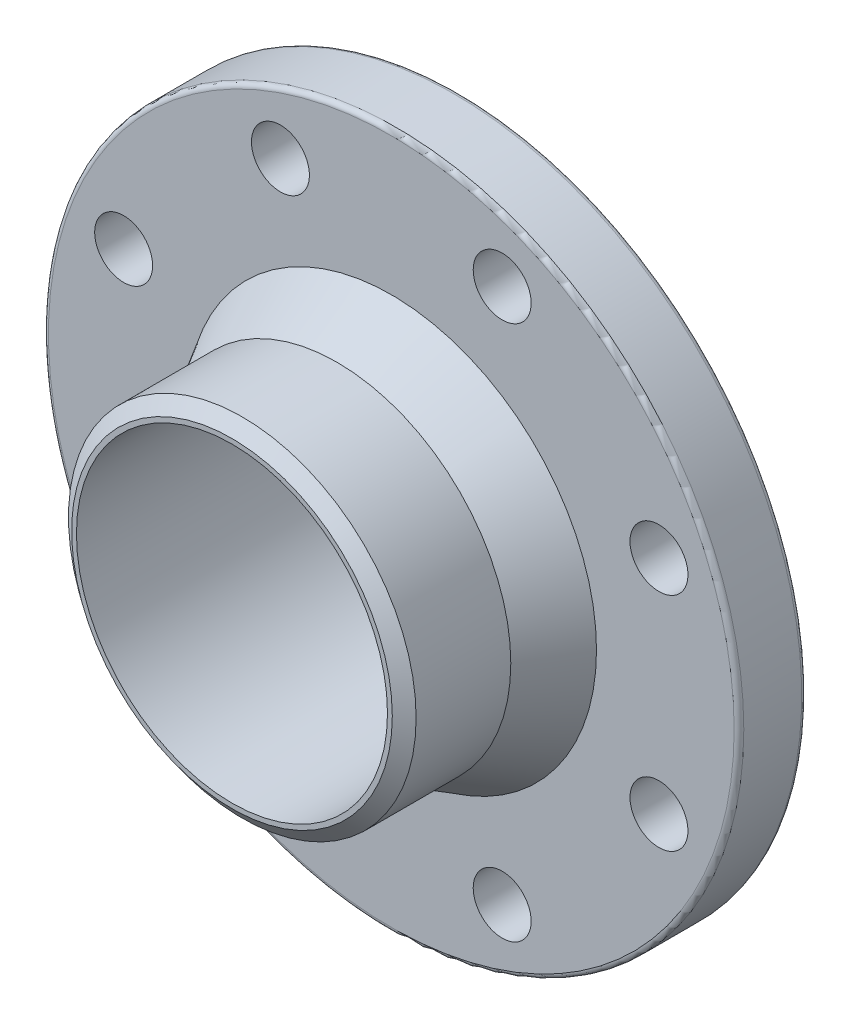
ISO-10303-21;
HEADER;
FILE_DESCRIPTION(('STEP AP214'),'2;1');
FILE_NAME('part.step','',(''),(''),'','','');
FILE_SCHEMA(('AUTOMOTIVE_DESIGN { 1 0 10303 214 1 1 1 1 }'));
ENDSEC;
DATA;
#1=APPLICATION_CONTEXT('core data for automotive mechanical design processes');
#2=APPLICATION_PROTOCOL_DEFINITION('international standard','automotive_design',2000,#1);
#3=PRODUCT_CONTEXT('',#1,'mechanical');
#4=PRODUCT('Part','Part','',(#3));
#5=PRODUCT_RELATED_PRODUCT_CATEGORY('part','',(#4));
#6=PRODUCT_DEFINITION_FORMATION('','',#4);
#7=PRODUCT_DEFINITION_CONTEXT('part definition',#1,'design');
#8=PRODUCT_DEFINITION('design','',#6,#7);
#9=PRODUCT_DEFINITION_SHAPE('','',#8);
#10=(LENGTH_UNIT() NAMED_UNIT(*) SI_UNIT(.MILLI.,.METRE.));
#11=(NAMED_UNIT(*) PLANE_ANGLE_UNIT() SI_UNIT($,.RADIAN.));
#12=(NAMED_UNIT(*) SI_UNIT($,.STERADIAN.) SOLID_ANGLE_UNIT());
#13=UNCERTAINTY_MEASURE_WITH_UNIT(LENGTH_MEASURE(1.E-05),#10,'distance_accuracy_value','');
#14=(GEOMETRIC_REPRESENTATION_CONTEXT(3) GLOBAL_UNCERTAINTY_ASSIGNED_CONTEXT((#13)) GLOBAL_UNIT_ASSIGNED_CONTEXT((#10,
#11,#12)) REPRESENTATION_CONTEXT('',''));
#15=CARTESIAN_POINT('',(0.,0.,0.));
#16=DIRECTION('',(0.,0.,1.));
#17=DIRECTION('',(1.,0.,0.));
#18=AXIS2_PLACEMENT_3D('',#15,#16,#17);
#19=CARTESIAN_POINT('',(0.,0.,0.));
#20=DIRECTION('',(0.,0.,1.));
#21=DIRECTION('',(1.,0.,0.));
#22=AXIS2_PLACEMENT_3D('',#19,#20,#21);
#23=PLANE('',#22);
#24=CARTESIAN_POINT('',(0.,0.,0.));
#25=DIRECTION('',(0.,0.,-1.));
#26=DIRECTION('',(-1.,0.,0.));
#27=AXIS2_PLACEMENT_3D('',#24,#25,#26);
#28=CIRCLE('',#27,78.58125);
#29=CARTESIAN_POINT('',(-78.58125,0.,0.));
#30=VERTEX_POINT('',#29);
#31=EDGE_CURVE('E83',#30,#30,#28,.T.);
#32=ORIENTED_EDGE('',*,*,#31,.T.);
#33=EDGE_LOOP('',(#32));
#34=FACE_BOUND('',#33,.T.);
#35=CARTESIAN_POINT('',(0.,0.,0.));
#36=DIRECTION('',(0.,0.,1.));
#37=DIRECTION('',(1.,0.,0.));
#38=AXIS2_PLACEMENT_3D('',#35,#36,#37);
#39=CIRCLE('',#38,51.1302);
#40=CARTESIAN_POINT('',(-51.1302,0.,0.));
#41=VERTEX_POINT('',#40);
#42=EDGE_CURVE('E152',#41,#41,#39,.T.);
#43=ORIENTED_EDGE('',*,*,#42,.T.);
#44=EDGE_LOOP('',(#43));
#45=FACE_BOUND('',#44,.T.);
#46=ADVANCED_FACE('F39',(#34,#45),#23,.F.);
#47=CARTESIAN_POINT('',(0.,0.,76.2));
#48=DIRECTION('',(0.,0.,1.));
#49=DIRECTION('',(1.,0.,0.));
#50=AXIS2_PLACEMENT_3D('',#47,#48,#49);
#51=PLANE('',#50);
#52=CARTESIAN_POINT('',(0.,0.,76.2));
#53=DIRECTION('',(0.,0.,1.));
#54=DIRECTION('',(1.,0.,0.));
#55=AXIS2_PLACEMENT_3D('',#52,#53,#54);
#56=CIRCLE('',#55,52.7176999999636);
#57=CARTESIAN_POINT('',(52.7176999999636,0.,76.2));
#58=VERTEX_POINT('',#57);
#59=EDGE_CURVE('E73',#58,#58,#56,.T.);
#60=ORIENTED_EDGE('',*,*,#59,.T.);
#61=EDGE_LOOP('',(#60));
#62=FACE_BOUND('',#61,.T.);
#63=CARTESIAN_POINT('',(0.,0.,76.2));
#64=DIRECTION('',(0.,0.,1.));
#65=DIRECTION('',(1.,0.,0.));
#66=AXIS2_PLACEMENT_3D('',#63,#64,#65);
#67=CIRCLE('',#66,51.1302);
#68=CARTESIAN_POINT('',(-51.1302,0.,76.2));
#69=VERTEX_POINT('',#68);
#70=EDGE_CURVE('E151',#69,#69,#67,.T.);
#71=ORIENTED_EDGE('',*,*,#70,.F.);
#72=EDGE_LOOP('',(#71));
#73=FACE_BOUND('',#72,.T.);
#74=ADVANCED_FACE('F163',(#62,#73),#51,.T.);
#75=CARTESIAN_POINT('',(0.,0.,23.8125));
#76=DIRECTION('',(0.,0.,1.));
#77=DIRECTION('',(1.,0.,0.));
#78=AXIS2_PLACEMENT_3D('',#75,#76,#77);
#79=PLANE('',#78);
#80=CARTESIAN_POINT('',(0.,0.,23.8125));
#81=DIRECTION('',(0.,0.,1.));
#82=DIRECTION('',(1.,0.,0.));
#83=AXIS2_PLACEMENT_3D('',#80,#81,#82);
#84=CIRCLE('',#83,112.7125);
#85=CARTESIAN_POINT('',(112.7125,0.,23.8125));
#86=VERTEX_POINT('',#85);
#87=EDGE_CURVE('E47',#86,#86,#84,.T.);
#88=ORIENTED_EDGE('',*,*,#87,.T.);
#89=EDGE_LOOP('',(#88));
#90=FACE_BOUND('',#89,.T.);
#91=CARTESIAN_POINT('',(87.9995254716996,36.4505969327758,23.8125));
#92=DIRECTION('',(0.,0.,1.));
#93=DIRECTION('',(0.707106781186556,-0.707106781186539,0.));
#94=AXIS2_PLACEMENT_3D('',#91,#92,#93);
#95=CIRCLE('',#94,9.52500000000001);
#96=CARTESIAN_POINT('',(94.7347175625016,29.715404841974,23.8125));
#97=VERTEX_POINT('',#96);
#98=EDGE_CURVE('E111',#97,#97,#95,.T.);
#99=ORIENTED_EDGE('',*,*,#98,.F.);
#100=EDGE_LOOP('',(#99));
#101=FACE_BOUND('',#100,.T.);
#102=CARTESIAN_POINT('',(36.4505969327755,-87.9995254716998,23.8125));
#103=DIRECTION('',(0.,0.,1.));
#104=DIRECTION('',(-0.707106781186541,-0.707106781186554,0.));
#105=AXIS2_PLACEMENT_3D('',#102,#103,#104);
#106=CIRCLE('',#105,9.52500000000001);
#107=CARTESIAN_POINT('',(29.7154048419737,-94.7347175625017,23.8125));
#108=VERTEX_POINT('',#107);
#109=EDGE_CURVE('E103',#108,#108,#106,.T.);
#110=ORIENTED_EDGE('',*,*,#109,.F.);
#111=EDGE_LOOP('',(#110));
#112=FACE_BOUND('',#111,.T.);
#113=CARTESIAN_POINT('',(-87.9995254716999,-36.4505969327752,23.8125));
#114=DIRECTION('',(0.,0.,1.));
#115=DIRECTION('',(-0.707106781186551,0.707106781186544,0.));
#116=AXIS2_PLACEMENT_3D('',#113,#114,#115);
#117=CIRCLE('',#116,9.52500000000001);
#118=CARTESIAN_POINT('',(-94.7347175625018,-29.7154048419734,23.8125));
#119=VERTEX_POINT('',#118);
#120=EDGE_CURVE('E95',#119,#119,#117,.T.);
#121=ORIENTED_EDGE('',*,*,#120,.F.);
#122=EDGE_LOOP('',(#121));
#123=FACE_BOUND('',#122,.T.);
#124=CARTESIAN_POINT('',(-36.4505969327749,87.9995254717,23.8125));
#125=DIRECTION('',(0.,0.,1.));
#126=DIRECTION('',(0.707106781186546,0.707106781186549,0.));
#127=AXIS2_PLACEMENT_3D('',#124,#125,#126);
#128=CIRCLE('',#127,9.52500000000001);
#129=CARTESIAN_POINT('',(-29.715404841973,94.7347175625019,23.8125));
#130=VERTEX_POINT('',#129);
#131=EDGE_CURVE('E87',#130,#130,#128,.T.);
#132=ORIENTED_EDGE('',*,*,#131,.F.);
#133=EDGE_LOOP('',(#132));
#134=FACE_BOUND('',#133,.T.);
#135=CARTESIAN_POINT('',(36.4505969327749,87.9995254717,23.8125));
#136=DIRECTION('',(0.,0.,1.));
#137=DIRECTION('',(1.,0.,0.));
#138=AXIS2_PLACEMENT_3D('',#135,#136,#137);
#139=CIRCLE('',#138,9.52500000000001);
#140=CARTESIAN_POINT('',(45.9755969327749,87.9995254717,23.8125));
#141=VERTEX_POINT('',#140);
#142=EDGE_CURVE('E77',#141,#141,#139,.T.);
#143=ORIENTED_EDGE('',*,*,#142,.F.);
#144=EDGE_LOOP('',(#143));
#145=FACE_BOUND('',#144,.T.);
#146=CARTESIAN_POINT('',(-87.9995254717002,36.4505969327746,23.8125));
#147=DIRECTION('',(0.,0.,1.));
#148=DIRECTION('',(0.,1.,0.));
#149=AXIS2_PLACEMENT_3D('',#146,#147,#148);
#150=CIRCLE('',#149,9.52500000000001);
#151=CARTESIAN_POINT('',(-87.9995254717002,45.9755969327746,23.8125));
#152=VERTEX_POINT('',#151);
#153=EDGE_CURVE('E91',#152,#152,#150,.T.);
#154=ORIENTED_EDGE('',*,*,#153,.F.);
#155=EDGE_LOOP('',(#154));
#156=FACE_BOUND('',#155,.T.);
#157=CARTESIAN_POINT('',(-36.4505969327749,-87.9995254717,23.8125));
#158=DIRECTION('',(0.,0.,1.));
#159=DIRECTION('',(-1.,0.,0.));
#160=AXIS2_PLACEMENT_3D('',#157,#158,#159);
#161=CIRCLE('',#160,9.52500000000001);
#162=CARTESIAN_POINT('',(-45.9755969327749,-87.9995254717,23.8125));
#163=VERTEX_POINT('',#162);
#164=EDGE_CURVE('E99',#163,#163,#161,.T.);
#165=ORIENTED_EDGE('',*,*,#164,.F.);
#166=EDGE_LOOP('',(#165));
#167=FACE_BOUND('',#166,.T.);
#168=CARTESIAN_POINT('',(87.9995254717004,-36.4505969327739,23.8125));
#169=DIRECTION('',(0.,0.,1.));
#170=DIRECTION('',(0.,-1.,0.));
#171=AXIS2_PLACEMENT_3D('',#168,#169,#170);
#172=CIRCLE('',#171,9.52500000000001);
#173=CARTESIAN_POINT('',(87.9995254717005,-45.9755969327739,23.8125));
#174=VERTEX_POINT('',#173);
#175=EDGE_CURVE('E107',#174,#174,#172,.T.);
#176=ORIENTED_EDGE('',*,*,#175,.F.);
#177=EDGE_LOOP('',(#176));
#178=FACE_BOUND('',#177,.T.);
#179=CARTESIAN_POINT('',(0.,0.,23.8125));
#180=DIRECTION('',(0.,0.,1.));
#181=DIRECTION('',(1.,0.,0.));
#182=AXIS2_PLACEMENT_3D('',#179,#180,#181);
#183=CIRCLE('',#182,67.4624);
#184=CARTESIAN_POINT('',(67.4624,0.,23.8125));
#185=VERTEX_POINT('',#184);
#186=EDGE_CURVE('E143',#185,#185,#183,.T.);
#187=ORIENTED_EDGE('',*,*,#186,.F.);
#188=EDGE_LOOP('',(#187));
#189=FACE_BOUND('',#188,.T.);
#190=ADVANCED_FACE('F165',(#90,#101,#112,#123,#134,#145,#156,#167,#178,#189),#79,.T.);
#191=CARTESIAN_POINT('',(0.,0.,23.8125));
#192=DIRECTION('',(0.,0.,-1.));
#193=DIRECTION('',(-1.,0.,0.));
#194=AXIS2_PLACEMENT_3D('',#191,#192,#193);
#195=CYLINDRICAL_SURFACE('',#194,114.3);
#196=CARTESIAN_POINT('',(0.,0.,3.175));
#197=DIRECTION('',(0.,0.,-1.));
#198=DIRECTION('',(-1.,0.,0.));
#199=AXIS2_PLACEMENT_3D('',#196,#197,#198);
#200=CIRCLE('',#199,114.3);
#201=CARTESIAN_POINT('',(-114.3,0.,3.175));
#202=VERTEX_POINT('',#201);
#203=EDGE_CURVE('E54',#202,#202,#200,.F.);
#204=ORIENTED_EDGE('',*,*,#203,.T.);
#205=EDGE_LOOP('',(#204));
#206=FACE_BOUND('',#205,.T.);
#207=CARTESIAN_POINT('',(0.,0.,22.225));
#208=DIRECTION('',(0.,0.,1.));
#209=DIRECTION('',(1.,0.,0.));
#210=AXIS2_PLACEMENT_3D('',#207,#208,#209);
#211=CIRCLE('',#210,114.3);
#212=CARTESIAN_POINT('',(114.3,0.,22.225));
#213=VERTEX_POINT('',#212);
#214=EDGE_CURVE('E60',#213,#213,#211,.F.);
#215=ORIENTED_EDGE('',*,*,#214,.T.);
#216=EDGE_LOOP('',(#215));
#217=FACE_BOUND('',#216,.T.);
#218=ADVANCED_FACE('F172',(#206,#217),#195,.T.);
#219=CARTESIAN_POINT('',(36.4505969327749,87.9995254717,23.8125));
#220=DIRECTION('',(0.,0.,-1.));
#221=DIRECTION('',(-1.,0.,0.));
#222=AXIS2_PLACEMENT_3D('',#219,#220,#221);
#223=CYLINDRICAL_SURFACE('',#222,9.52500000000001);
#224=ORIENTED_EDGE('',*,*,#142,.T.);
#225=EDGE_LOOP('',(#224));
#226=FACE_BOUND('',#225,.T.);
#227=CARTESIAN_POINT('',(36.4505969327749,87.9995254717,1.5875));
#228=DIRECTION('',(0.,0.,-1.));
#229=DIRECTION('',(-1.,0.,0.));
#230=AXIS2_PLACEMENT_3D('',#227,#228,#229);
#231=CIRCLE('',#230,9.52500000000001);
#232=CARTESIAN_POINT('',(26.9255969327749,87.9995254717,1.5875));
#233=VERTEX_POINT('',#232);
#234=EDGE_CURVE('E114',#233,#233,#231,.T.);
#235=ORIENTED_EDGE('',*,*,#234,.T.);
#236=EDGE_LOOP('',(#235));
#237=FACE_BOUND('',#236,.T.);
#238=ADVANCED_FACE('F210',(#226,#237),#223,.F.);
#239=CARTESIAN_POINT('',(-36.4505969327749,87.9995254717,23.8125));
#240=DIRECTION('',(0.,0.,-1.));
#241=DIRECTION('',(-1.,0.,0.));
#242=AXIS2_PLACEMENT_3D('',#239,#240,#241);
#243=CYLINDRICAL_SURFACE('',#242,9.52500000000001);
#244=ORIENTED_EDGE('',*,*,#131,.T.);
#245=EDGE_LOOP('',(#244));
#246=FACE_BOUND('',#245,.T.);
#247=CARTESIAN_POINT('',(-36.4505969327749,87.9995254717,1.5875));
#248=DIRECTION('',(0.,0.,-1.));
#249=DIRECTION('',(-1.,0.,0.));
#250=AXIS2_PLACEMENT_3D('',#247,#248,#249);
#251=CIRCLE('',#250,9.52500000000001);
#252=CARTESIAN_POINT('',(-45.9755969327749,87.9995254717,1.5875));
#253=VERTEX_POINT('',#252);
#254=EDGE_CURVE('E118',#253,#253,#251,.T.);
#255=ORIENTED_EDGE('',*,*,#254,.T.);
#256=EDGE_LOOP('',(#255));
#257=FACE_BOUND('',#256,.T.);
#258=ADVANCED_FACE('F206',(#246,#257),#243,.F.);
#259=CARTESIAN_POINT('',(-87.9995254717002,36.4505969327746,23.8125));
#260=DIRECTION('',(0.,0.,-1.));
#261=DIRECTION('',(-1.,0.,0.));
#262=AXIS2_PLACEMENT_3D('',#259,#260,#261);
#263=CYLINDRICAL_SURFACE('',#262,9.52500000000001);
#264=ORIENTED_EDGE('',*,*,#153,.T.);
#265=EDGE_LOOP('',(#264));
#266=FACE_BOUND('',#265,.T.);
#267=CARTESIAN_POINT('',(-87.9995254717002,36.4505969327746,1.5875));
#268=DIRECTION('',(0.,0.,-1.));
#269=DIRECTION('',(-1.,0.,0.));
#270=AXIS2_PLACEMENT_3D('',#267,#268,#269);
#271=CIRCLE('',#270,9.52500000000001);
#272=CARTESIAN_POINT('',(-97.5245254717002,36.4505969327746,1.5875));
#273=VERTEX_POINT('',#272);
#274=EDGE_CURVE('E122',#273,#273,#271,.T.);
#275=ORIENTED_EDGE('',*,*,#274,.T.);
#276=EDGE_LOOP('',(#275));
#277=FACE_BOUND('',#276,.T.);
#278=ADVANCED_FACE('F202',(#266,#277),#263,.F.);
#279=CARTESIAN_POINT('',(-87.9995254716999,-36.4505969327752,23.8125));
#280=DIRECTION('',(0.,0.,-1.));
#281=DIRECTION('',(-1.,0.,0.));
#282=AXIS2_PLACEMENT_3D('',#279,#280,#281);
#283=CYLINDRICAL_SURFACE('',#282,9.52500000000001);
#284=ORIENTED_EDGE('',*,*,#120,.T.);
#285=EDGE_LOOP('',(#284));
#286=FACE_BOUND('',#285,.T.);
#287=CARTESIAN_POINT('',(-87.9995254716999,-36.4505969327752,1.5875));
#288=DIRECTION('',(0.,0.,-1.));
#289=DIRECTION('',(-1.,0.,0.));
#290=AXIS2_PLACEMENT_3D('',#287,#288,#289);
#291=CIRCLE('',#290,9.52500000000001);
#292=CARTESIAN_POINT('',(-97.5245254716999,-36.4505969327752,1.5875));
#293=VERTEX_POINT('',#292);
#294=EDGE_CURVE('E126',#293,#293,#291,.T.);
#295=ORIENTED_EDGE('',*,*,#294,.T.);
#296=EDGE_LOOP('',(#295));
#297=FACE_BOUND('',#296,.T.);
#298=ADVANCED_FACE('F198',(#286,#297),#283,.F.);
#299=CARTESIAN_POINT('',(-36.4505969327749,-87.9995254717,23.8125));
#300=DIRECTION('',(0.,0.,-1.));
#301=DIRECTION('',(-1.,0.,0.));
#302=AXIS2_PLACEMENT_3D('',#299,#300,#301);
#303=CYLINDRICAL_SURFACE('',#302,9.52500000000001);
#304=ORIENTED_EDGE('',*,*,#164,.T.);
#305=EDGE_LOOP('',(#304));
#306=FACE_BOUND('',#305,.T.);
#307=CARTESIAN_POINT('',(-36.4505969327749,-87.9995254717,1.5875));
#308=DIRECTION('',(0.,0.,-1.));
#309=DIRECTION('',(-1.,0.,0.));
#310=AXIS2_PLACEMENT_3D('',#307,#308,#309);
#311=CIRCLE('',#310,9.52500000000001);
#312=CARTESIAN_POINT('',(-45.9755969327749,-87.9995254717,1.5875));
#313=VERTEX_POINT('',#312);
#314=EDGE_CURVE('E130',#313,#313,#311,.T.);
#315=ORIENTED_EDGE('',*,*,#314,.T.);
#316=EDGE_LOOP('',(#315));
#317=FACE_BOUND('',#316,.T.);
#318=ADVANCED_FACE('F194',(#306,#317),#303,.F.);
#319=CARTESIAN_POINT('',(36.4505969327755,-87.9995254716998,23.8125));
#320=DIRECTION('',(0.,0.,-1.));
#321=DIRECTION('',(-1.,0.,0.));
#322=AXIS2_PLACEMENT_3D('',#319,#320,#321);
#323=CYLINDRICAL_SURFACE('',#322,9.52500000000001);
#324=ORIENTED_EDGE('',*,*,#109,.T.);
#325=EDGE_LOOP('',(#324));
#326=FACE_BOUND('',#325,.T.);
#327=CARTESIAN_POINT('',(36.4505969327755,-87.9995254716998,1.5875));
#328=DIRECTION('',(0.,0.,-1.));
#329=DIRECTION('',(-1.,0.,0.));
#330=AXIS2_PLACEMENT_3D('',#327,#328,#329);
#331=CIRCLE('',#330,9.52500000000001);
#332=CARTESIAN_POINT('',(26.9255969327755,-87.9995254716998,1.5875));
#333=VERTEX_POINT('',#332);
#334=EDGE_CURVE('E134',#333,#333,#331,.T.);
#335=ORIENTED_EDGE('',*,*,#334,.T.);
#336=EDGE_LOOP('',(#335));
#337=FACE_BOUND('',#336,.T.);
#338=ADVANCED_FACE('F190',(#326,#337),#323,.F.);
#339=CARTESIAN_POINT('',(87.9995254717004,-36.4505969327739,23.8125));
#340=DIRECTION('',(0.,0.,-1.));
#341=DIRECTION('',(-1.,0.,0.));
#342=AXIS2_PLACEMENT_3D('',#339,#340,#341);
#343=CYLINDRICAL_SURFACE('',#342,9.52500000000001);
#344=ORIENTED_EDGE('',*,*,#175,.T.);
#345=EDGE_LOOP('',(#344));
#346=FACE_BOUND('',#345,.T.);
#347=CARTESIAN_POINT('',(87.9995254717004,-36.4505969327739,1.5875));
#348=DIRECTION('',(0.,0.,-1.));
#349=DIRECTION('',(-1.,0.,0.));
#350=AXIS2_PLACEMENT_3D('',#347,#348,#349);
#351=CIRCLE('',#350,9.52500000000001);
#352=CARTESIAN_POINT('',(78.4745254717004,-36.4505969327739,1.5875));
#353=VERTEX_POINT('',#352);
#354=EDGE_CURVE('E82',#353,#353,#351,.T.);
#355=ORIENTED_EDGE('',*,*,#354,.T.);
#356=EDGE_LOOP('',(#355));
#357=FACE_BOUND('',#356,.T.);
#358=ADVANCED_FACE('F186',(#346,#357),#343,.F.);
#359=CARTESIAN_POINT('',(87.9995254716996,36.4505969327758,23.8125));
#360=DIRECTION('',(0.,0.,-1.));
#361=DIRECTION('',(-1.,0.,0.));
#362=AXIS2_PLACEMENT_3D('',#359,#360,#361);
#363=CYLINDRICAL_SURFACE('',#362,9.52500000000001);
#364=ORIENTED_EDGE('',*,*,#98,.T.);
#365=EDGE_LOOP('',(#364));
#366=FACE_BOUND('',#365,.T.);
#367=CARTESIAN_POINT('',(87.9995254716996,36.4505969327758,1.5875));
#368=DIRECTION('',(0.,0.,-1.));
#369=DIRECTION('',(-1.,0.,0.));
#370=AXIS2_PLACEMENT_3D('',#367,#368,#369);
#371=CIRCLE('',#370,9.52500000000001);
#372=CARTESIAN_POINT('',(78.4745254716996,36.4505969327758,1.5875));
#373=VERTEX_POINT('',#372);
#374=EDGE_CURVE('E78',#373,#373,#371,.T.);
#375=ORIENTED_EDGE('',*,*,#374,.T.);
#376=EDGE_LOOP('',(#375));
#377=FACE_BOUND('',#376,.T.);
#378=ADVANCED_FACE('F183',(#366,#377),#363,.F.);
#379=CARTESIAN_POINT('',(0.,0.,1.5875));
#380=DIRECTION('',(0.,0.,-1.));
#381=DIRECTION('',(-1.,0.,0.));
#382=AXIS2_PLACEMENT_3D('',#379,#380,#381);
#383=PLANE('',#382);
#384=CARTESIAN_POINT('',(0.,0.,1.5875));
#385=DIRECTION('',(0.,0.,-1.));
#386=DIRECTION('',(-1.,0.,0.));
#387=AXIS2_PLACEMENT_3D('',#384,#385,#386);
#388=CIRCLE('',#387,80.16875);
#389=CARTESIAN_POINT('',(-80.16875,0.,1.5875));
#390=VERTEX_POINT('',#389);
#391=EDGE_CURVE('E11',#390,#390,#388,.F.);
#392=ORIENTED_EDGE('',*,*,#391,.T.);
#393=EDGE_LOOP('',(#392));
#394=FACE_BOUND('',#393,.T.);
#395=CARTESIAN_POINT('',(0.,0.,1.5875));
#396=DIRECTION('',(0.,0.,-1.));
#397=DIRECTION('',(-1.,0.,0.));
#398=AXIS2_PLACEMENT_3D('',#395,#396,#397);
#399=CIRCLE('',#398,112.7125);
#400=CARTESIAN_POINT('',(-112.7125,0.,1.5875));
#401=VERTEX_POINT('',#400);
#402=EDGE_CURVE('E65',#401,#401,#399,.T.);
#403=ORIENTED_EDGE('',*,*,#402,.T.);
#404=EDGE_LOOP('',(#403));
#405=FACE_BOUND('',#404,.T.);
#406=ORIENTED_EDGE('',*,*,#374,.F.);
#407=EDGE_LOOP('',(#406));
#408=FACE_BOUND('',#407,.T.);
#409=ORIENTED_EDGE('',*,*,#354,.F.);
#410=EDGE_LOOP('',(#409));
#411=FACE_BOUND('',#410,.T.);
#412=ORIENTED_EDGE('',*,*,#334,.F.);
#413=EDGE_LOOP('',(#412));
#414=FACE_BOUND('',#413,.T.);
#415=ORIENTED_EDGE('',*,*,#314,.F.);
#416=EDGE_LOOP('',(#415));
#417=FACE_BOUND('',#416,.T.);
#418=ORIENTED_EDGE('',*,*,#294,.F.);
#419=EDGE_LOOP('',(#418));
#420=FACE_BOUND('',#419,.T.);
#421=ORIENTED_EDGE('',*,*,#274,.F.);
#422=EDGE_LOOP('',(#421));
#423=FACE_BOUND('',#422,.T.);
#424=ORIENTED_EDGE('',*,*,#254,.F.);
#425=EDGE_LOOP('',(#424));
#426=FACE_BOUND('',#425,.T.);
#427=ORIENTED_EDGE('',*,*,#234,.F.);
#428=EDGE_LOOP('',(#427));
#429=FACE_BOUND('',#428,.T.);
#430=ADVANCED_FACE('F180',(#394,#405,#408,#411,#414,#417,#420,#423,#426,#429),#383,.T.);
#431=CARTESIAN_POINT('',(0.,0.,23.8125));
#432=DIRECTION('',(0.,0.,-1.));
#433=DIRECTION('',(1.,0.,0.));
#434=AXIS2_PLACEMENT_3D('',#431,#432,#433);
#435=CONICAL_SURFACE('',#434,67.4624,0.5235987755983);
#436=CARTESIAN_POINT('',(0.,0.,41.6741007479732));
#437=DIRECTION('',(0.,0.,-1.));
#438=DIRECTION('',(-1.,0.,0.));
#439=AXIS2_PLACEMENT_3D('',#436,#437,#438);
#440=CIRCLE('',#439,57.15);
#441=CARTESIAN_POINT('',(-57.15,0.,41.6741007479732));
#442=VERTEX_POINT('',#441);
#443=EDGE_CURVE('E147',#442,#442,#440,.F.);
#444=ORIENTED_EDGE('',*,*,#443,.F.);
#445=EDGE_LOOP('',(#444));
#446=FACE_BOUND('',#445,.T.);
#447=ORIENTED_EDGE('',*,*,#186,.T.);
#448=EDGE_LOOP('',(#447));
#449=FACE_BOUND('',#448,.T.);
#450=ADVANCED_FACE('F178',(#446,#449),#435,.T.);
#451=CARTESIAN_POINT('',(0.,0.,-500000.));
#452=DIRECTION('',(0.,0.,1.));
#453=DIRECTION('',(1.,0.,0.));
#454=AXIS2_PLACEMENT_3D('',#451,#452,#453);
#455=CYLINDRICAL_SURFACE('',#454,57.15);
#456=CARTESIAN_POINT('',(0.,0.,72.798976591173));
#457=DIRECTION('',(0.,0.,1.));
#458=DIRECTION('',(1.,0.,0.));
#459=AXIS2_PLACEMENT_3D('',#456,#457,#458);
#460=CIRCLE('',#459,57.15);
#461=CARTESIAN_POINT('',(57.15,0.,72.798976591173));
#462=VERTEX_POINT('',#461);
#463=EDGE_CURVE('E69',#462,#462,#460,.F.);
#464=ORIENTED_EDGE('',*,*,#463,.T.);
#465=EDGE_LOOP('',(#464));
#466=FACE_BOUND('',#465,.T.);
#467=ORIENTED_EDGE('',*,*,#443,.T.);
#468=EDGE_LOOP('',(#467));
#469=FACE_BOUND('',#468,.T.);
#470=ADVANCED_FACE('F221',(#466,#469),#455,.T.);
#471=CARTESIAN_POINT('',(0.,0.,76.1999999999716));
#472=DIRECTION('',(0.,0.,-1.));
#473=DIRECTION('',(-1.,0.,0.));
#474=AXIS2_PLACEMENT_3D('',#471,#472,#473);
#475=CONICAL_SURFACE('',#474,52.7177000000006,0.916297857299865);
#476=ORIENTED_EDGE('',*,*,#463,.F.);
#477=EDGE_LOOP('',(#476));
#478=FACE_BOUND('',#477,.T.);
#479=ORIENTED_EDGE('',*,*,#59,.F.);
#480=EDGE_LOOP('',(#479));
#481=FACE_BOUND('',#480,.T.);
#482=ADVANCED_FACE('F218',(#478,#481),#475,.T.);
#483=CARTESIAN_POINT('',(0.,0.,76.2));
#484=DIRECTION('',(0.,0.,-1.));
#485=DIRECTION('',(-1.,0.,0.));
#486=AXIS2_PLACEMENT_3D('',#483,#484,#485);
#487=CYLINDRICAL_SURFACE('',#486,51.1302);
#488=CARTESIAN_POINT('',(-51.1302,0.,76.2));
#489=CARTESIAN_POINT('',(-51.1302,0.,75.40625));
#490=CARTESIAN_POINT('',(-51.1302,0.,74.6125));
#491=CARTESIAN_POINT('',(-51.1302,0.,73.025));
#492=CARTESIAN_POINT('',(-51.1302,0.,72.23125));
#493=CARTESIAN_POINT('',(-51.1302,0.,70.64375));
#494=CARTESIAN_POINT('',(-51.1302,0.,69.85));
#495=CARTESIAN_POINT('',(-51.1302,0.,68.2625));
#496=CARTESIAN_POINT('',(-51.1302,0.,67.46875));
#497=CARTESIAN_POINT('',(-51.1302,0.,65.88125));
#498=CARTESIAN_POINT('',(-51.1302,0.,65.0875));
#499=CARTESIAN_POINT('',(-51.1302,0.,63.5));
#500=CARTESIAN_POINT('',(-51.1302,0.,62.70625));
#501=CARTESIAN_POINT('',(-51.1302,0.,61.11875));
#502=CARTESIAN_POINT('',(-51.1302,0.,60.325));
#503=CARTESIAN_POINT('',(-51.1302,0.,58.7375));
#504=CARTESIAN_POINT('',(-51.1302,0.,57.94375));
#505=CARTESIAN_POINT('',(-51.1302,0.,56.35625));
#506=CARTESIAN_POINT('',(-51.1302,0.,55.5625));
#507=CARTESIAN_POINT('',(-51.1302,0.,53.975));
#508=CARTESIAN_POINT('',(-51.1302,0.,53.18125));
#509=CARTESIAN_POINT('',(-51.1302,0.,51.59375));
#510=CARTESIAN_POINT('',(-51.1302,0.,50.8));
#511=CARTESIAN_POINT('',(-51.1302,0.,49.2125));
#512=CARTESIAN_POINT('',(-51.1302,0.,48.41875));
#513=CARTESIAN_POINT('',(-51.1302,0.,46.83125));
#514=CARTESIAN_POINT('',(-51.1302,0.,46.0375));
#515=CARTESIAN_POINT('',(-51.1302,0.,44.45));
#516=CARTESIAN_POINT('',(-51.1302,0.,43.65625));
#517=CARTESIAN_POINT('',(-51.1302,0.,42.06875));
#518=CARTESIAN_POINT('',(-51.1302,0.,41.275));
#519=CARTESIAN_POINT('',(-51.1302,0.,39.6875));
#520=CARTESIAN_POINT('',(-51.1302,0.,38.89375));
#521=CARTESIAN_POINT('',(-51.1302,0.,37.30625));
#522=CARTESIAN_POINT('',(-51.1302,0.,36.5125));
#523=CARTESIAN_POINT('',(-51.1302,0.,34.925));
#524=CARTESIAN_POINT('',(-51.1302,0.,34.13125));
#525=CARTESIAN_POINT('',(-51.1302,0.,32.54375));
#526=CARTESIAN_POINT('',(-51.1302,0.,31.75));
#527=CARTESIAN_POINT('',(-51.1302,0.,30.1625));
#528=CARTESIAN_POINT('',(-51.1302,0.,29.36875));
#529=CARTESIAN_POINT('',(-51.1302,0.,27.78125));
#530=CARTESIAN_POINT('',(-51.1302,0.,26.9875));
#531=CARTESIAN_POINT('',(-51.1302,0.,25.4));
#532=CARTESIAN_POINT('',(-51.1302,0.,24.60625));
#533=CARTESIAN_POINT('',(-51.1302,0.,23.01875));
#534=CARTESIAN_POINT('',(-51.1302,0.,22.225));
#535=CARTESIAN_POINT('',(-51.1302,0.,20.6375));
#536=CARTESIAN_POINT('',(-51.1302,0.,19.84375));
#537=CARTESIAN_POINT('',(-51.1302,0.,18.25625));
#538=CARTESIAN_POINT('',(-51.1302,0.,17.4625));
#539=CARTESIAN_POINT('',(-51.1302,0.,15.875));
#540=CARTESIAN_POINT('',(-51.1302,0.,15.08125));
#541=CARTESIAN_POINT('',(-51.1302,0.,13.49375));
#542=CARTESIAN_POINT('',(-51.1302,0.,12.7));
#543=CARTESIAN_POINT('',(-51.1302,0.,11.1125));
#544=CARTESIAN_POINT('',(-51.1302,0.,10.31875));
#545=CARTESIAN_POINT('',(-51.1302,0.,8.73125));
#546=CARTESIAN_POINT('',(-51.1302,0.,7.93750000000001));
#547=CARTESIAN_POINT('',(-51.1302,0.,6.35));
#548=CARTESIAN_POINT('',(-51.1302,0.,5.55625));
#549=CARTESIAN_POINT('',(-51.1302,0.,3.96875));
#550=CARTESIAN_POINT('',(-51.1302,0.,3.175));
#551=CARTESIAN_POINT('',(-51.1302,0.,1.5875));
#552=CARTESIAN_POINT('',(-51.1302,0.,0.793750000000001));
#553=CARTESIAN_POINT('',(-51.1302,0.,0.));
#554=B_SPLINE_CURVE_WITH_KNOTS('',3,(#488,#489,#490,#491,#492,#493,#494,#495,#496,#497,#498,
#499,#500,#501,#502,#503,#504,#505,#506,#507,#508,#509,#510,#511,#512,#513,#514,#515,#516,#517,
#518,#519,#520,#521,#522,#523,#524,#525,#526,#527,#528,#529,#530,#531,#532,#533,#534,#535,#536,
#537,#538,#539,#540,#541,#542,#543,#544,#545,#546,#547,#548,#549,#550,#551,#552,#553),
.UNSPECIFIED.,.F.,.F.,(4,2,2,2,2,2,2,2,2,2,2,2,2,2,2,2,2,2,2,2,2,2,2,2,2,2,2,2,2,2,2,2,4),(0.,
2.38124999999999,4.76249999999999,7.14374999999999,9.52499999999999,11.90625,14.2875,16.66875,
19.05,21.43125,23.8125,26.19375,28.575,30.95625,33.3375,35.71875,38.1,40.48125,42.8625,45.24375,
47.625,50.00625,52.3875,54.76875,57.15,59.53125,61.9125,64.29375,66.675,69.05625,71.4375,
73.81875,76.2),.UNSPECIFIED.);
#555=EDGE_CURVE('BSEAM160',#69,#41,#554,.T.);
#556=ORIENTED_EDGE('',*,*,#70,.T.);
#557=ORIENTED_EDGE('',*,*,#42,.F.);
#558=ORIENTED_EDGE('',*,*,#555,.T.);
#559=ORIENTED_EDGE('',*,*,#555,.F.);
#560=EDGE_LOOP('',(#556,#558,#557,#559));
#561=FACE_BOUND('',#560,.T.);
#562=ADVANCED_FACE('F160',(#561),#487,.F.);
#563=CARTESIAN_POINT('',(0.,0.,3.175));
#564=DIRECTION('',(0.,0.,-1.));
#565=DIRECTION('',(-1.,0.,0.));
#566=AXIS2_PLACEMENT_3D('',#563,#564,#565);
#567=TOROIDAL_SURFACE('',#566,112.7125,1.5875);
#568=ORIENTED_EDGE('',*,*,#203,.F.);
#569=EDGE_LOOP('',(#568));
#570=FACE_BOUND('',#569,.T.);
#571=ORIENTED_EDGE('',*,*,#402,.F.);
#572=EDGE_LOOP('',(#571));
#573=FACE_BOUND('',#572,.T.);
#574=ADVANCED_FACE('F223',(#570,#573),#567,.T.);
#575=CARTESIAN_POINT('',(0.,0.,22.225));
#576=DIRECTION('',(0.,0.,1.));
#577=DIRECTION('',(1.,0.,0.));
#578=AXIS2_PLACEMENT_3D('',#575,#576,#577);
#579=TOROIDAL_SURFACE('',#578,112.7125,1.5875);
#580=ORIENTED_EDGE('',*,*,#214,.F.);
#581=EDGE_LOOP('',(#580));
#582=FACE_BOUND('',#581,.T.);
#583=ORIENTED_EDGE('',*,*,#87,.F.);
#584=EDGE_LOOP('',(#583));
#585=FACE_BOUND('',#584,.T.);
#586=ADVANCED_FACE('F225',(#582,#585),#579,.T.);
#587=CARTESIAN_POINT('',(0.,0.,0.));
#588=DIRECTION('',(0.,0.,-1.));
#589=DIRECTION('',(-1.,0.,0.));
#590=AXIS2_PLACEMENT_3D('',#587,#588,#589);
#591=TOROIDAL_SURFACE('',#590,80.16875,1.5875);
#592=ORIENTED_EDGE('',*,*,#391,.F.);
#593=EDGE_LOOP('',(#592));
#594=FACE_BOUND('',#593,.T.);
#595=ORIENTED_EDGE('',*,*,#31,.F.);
#596=EDGE_LOOP('',(#595));
#597=FACE_BOUND('',#596,.T.);
#598=ADVANCED_FACE('F41',(#594,#597),#591,.F.);
#599=CLOSED_SHELL('',(#46,#74,#190,#218,#238,#258,#278,#298,#318,#338,#358,#378,#430,#450,#470,
#482,#562,#574,#586,#598));
#600=MANIFOLD_SOLID_BREP('B2',#599);
#601=ADVANCED_BREP_SHAPE_REPRESENTATION('',(#18,#600),#14);
#602=SHAPE_DEFINITION_REPRESENTATION(#9,#601);
ENDSEC;
END-ISO-10303-21;
